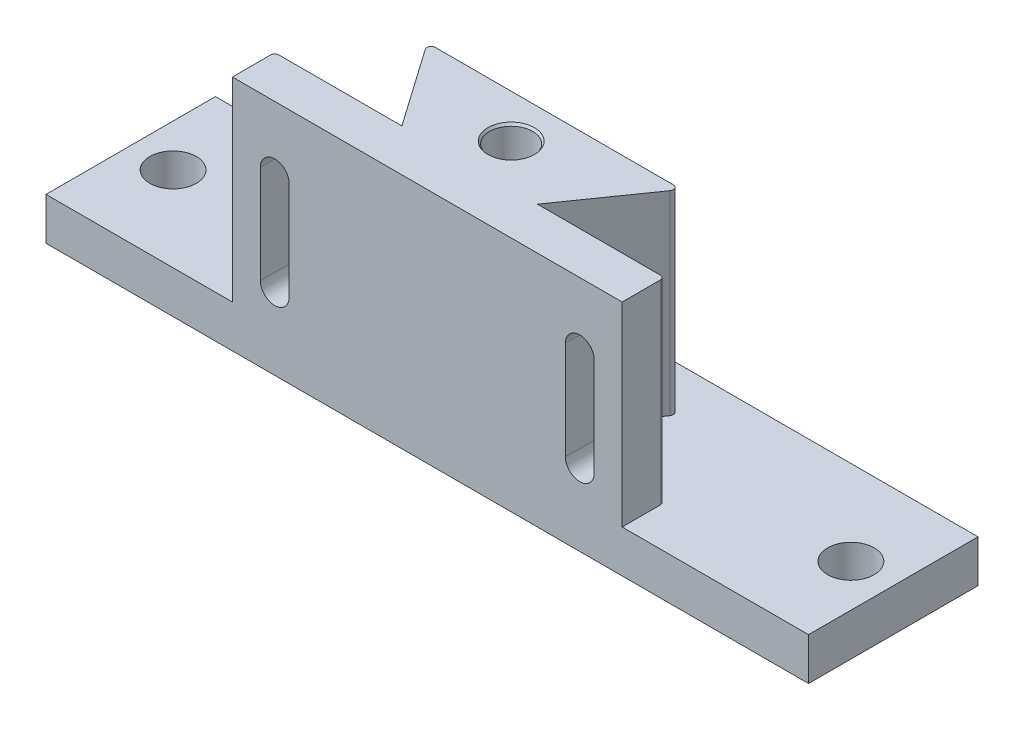
ISO-10303-21;
HEADER;
FILE_DESCRIPTION(('STEP AP214'),'2;1');
FILE_NAME('part.step','',(''),(''),'','','');
FILE_SCHEMA(('AUTOMOTIVE_DESIGN { 1 0 10303 214 1 1 1 1 }'));
ENDSEC;
DATA;
#1=APPLICATION_CONTEXT('core data for automotive mechanical design processes');
#2=APPLICATION_PROTOCOL_DEFINITION('international standard','automotive_design',2000,#1);
#3=PRODUCT_CONTEXT('',#1,'mechanical');
#4=PRODUCT('Part','Part','',(#3));
#5=PRODUCT_RELATED_PRODUCT_CATEGORY('part','',(#4));
#6=PRODUCT_DEFINITION_FORMATION('','',#4);
#7=PRODUCT_DEFINITION_CONTEXT('part definition',#1,'design');
#8=PRODUCT_DEFINITION('design','',#6,#7);
#9=PRODUCT_DEFINITION_SHAPE('','',#8);
#10=(LENGTH_UNIT() NAMED_UNIT(*) SI_UNIT(.MILLI.,.METRE.));
#11=(NAMED_UNIT(*) PLANE_ANGLE_UNIT() SI_UNIT($,.RADIAN.));
#12=(NAMED_UNIT(*) SI_UNIT($,.STERADIAN.) SOLID_ANGLE_UNIT());
#13=UNCERTAINTY_MEASURE_WITH_UNIT(LENGTH_MEASURE(1.E-05),#10,'distance_accuracy_value','');
#14=(GEOMETRIC_REPRESENTATION_CONTEXT(3) GLOBAL_UNCERTAINTY_ASSIGNED_CONTEXT((#13)) GLOBAL_UNIT_ASSIGNED_CONTEXT((#10,
#11,#12)) REPRESENTATION_CONTEXT('',''));
#15=CARTESIAN_POINT('',(0.,0.,0.));
#16=DIRECTION('',(0.,0.,1.));
#17=DIRECTION('',(1.,0.,0.));
#18=AXIS2_PLACEMENT_3D('',#15,#16,#17);
#19=CARTESIAN_POINT('',(0.,5.,0.));
#20=DIRECTION('',(0.,0.,-1.));
#21=DIRECTION('',(-1.,0.,0.));
#22=AXIS2_PLACEMENT_3D('',#19,#20,#21);
#23=PLANE('',#22);
#24=DIRECTION('',(0.,1.,0.));
#25=VECTOR('',#24,1.);
#26=CARTESIAN_POINT('',(15.3020753820972,8.8356786710353,0.));
#27=LINE('',#26,#25);
#28=CARTESIAN_POINT('',(15.3020753820972,8.8356786710353,0.));
#29=VERTEX_POINT('',#28);
#30=CARTESIAN_POINT('',(15.3020753820972,20.4356786710353,0.));
#31=VERTEX_POINT('',#30);
#32=EDGE_CURVE('E361',#29,#31,#27,.T.);
#33=ORIENTED_EDGE('',*,*,#32,.T.);
#34=CARTESIAN_POINT('',(17.0020753820972,20.4356786710353,0.));
#35=DIRECTION('',(0.,0.,1.));
#36=DIRECTION('',(1.,0.,0.));
#37=AXIS2_PLACEMENT_3D('',#34,#35,#36);
#38=CIRCLE('',#37,1.69999999999999);
#39=CARTESIAN_POINT('',(18.7020753820972,20.4356786710353,0.));
#40=VERTEX_POINT('',#39);
#41=EDGE_CURVE('E367',#40,#31,#38,.T.);
#42=ORIENTED_EDGE('',*,*,#41,.F.);
#43=DIRECTION('',(0.,1.,0.));
#44=VECTOR('',#43,1.);
#45=CARTESIAN_POINT('',(18.7020753820972,8.8356786710353,0.));
#46=LINE('',#45,#44);
#47=CARTESIAN_POINT('',(18.7020753820972,8.8356786710353,0.));
#48=VERTEX_POINT('',#47);
#49=EDGE_CURVE('E379',#48,#40,#46,.T.);
#50=ORIENTED_EDGE('',*,*,#49,.F.);
#51=CARTESIAN_POINT('',(17.0020753820972,8.8356786710353,0.));
#52=DIRECTION('',(0.,0.,1.));
#53=DIRECTION('',(1.,0.,0.));
#54=AXIS2_PLACEMENT_3D('',#51,#52,#53);
#55=CIRCLE('',#54,1.69999999999999);
#56=EDGE_CURVE('E377',#29,#48,#55,.T.);
#57=ORIENTED_EDGE('',*,*,#56,.F.);
#58=EDGE_LOOP('',(#33,#42,#50,#57));
#59=FACE_BOUND('',#58,.T.);
#60=DIRECTION('',(1.,0.,0.));
#61=VECTOR('',#60,1.);
#62=CARTESIAN_POINT('',(0.,5.,0.));
#63=LINE('',#62,#61);
#64=CARTESIAN_POINT('',(57.9979246179028,5.,0.));
#65=VERTEX_POINT('',#64);
#66=CARTESIAN_POINT('',(80.,5.,0.));
#67=VERTEX_POINT('',#66);
#68=EDGE_CURVE('E523',#65,#67,#63,.T.);
#69=ORIENTED_EDGE('',*,*,#68,.F.);
#70=DIRECTION('',(0.,-1.,0.));
#71=VECTOR('',#70,1.);
#72=CARTESIAN_POINT('',(57.9979246179028,28.,0.));
#73=LINE('',#72,#71);
#74=CARTESIAN_POINT('',(57.9979246179028,28.,0.));
#75=VERTEX_POINT('',#74);
#76=EDGE_CURVE('E485',#75,#65,#73,.T.);
#77=ORIENTED_EDGE('',*,*,#76,.F.);
#78=DIRECTION('',(1.,0.,0.));
#79=VECTOR('',#78,1.);
#80=CARTESIAN_POINT('',(0.,28.,0.));
#81=LINE('',#80,#79);
#82=CARTESIAN_POINT('',(12.0020753820972,28.,0.));
#83=VERTEX_POINT('',#82);
#84=EDGE_CURVE('E452',#83,#75,#81,.T.);
#85=ORIENTED_EDGE('',*,*,#84,.F.);
#86=DIRECTION('',(0.,-1.,0.));
#87=VECTOR('',#86,1.);
#88=CARTESIAN_POINT('',(12.0020753820972,28.,0.));
#89=LINE('',#88,#87);
#90=CARTESIAN_POINT('',(12.0020753820972,5.,0.));
#91=VERTEX_POINT('',#90);
#92=EDGE_CURVE('E488',#83,#91,#89,.T.);
#93=ORIENTED_EDGE('',*,*,#92,.T.);
#94=CARTESIAN_POINT('',(-10.,5.,0.));
#95=VERTEX_POINT('',#94);
#96=EDGE_CURVE('E518',#95,#91,#63,.T.);
#97=ORIENTED_EDGE('',*,*,#96,.F.);
#98=DIRECTION('',(0.,-1.,0.));
#99=VECTOR('',#98,1.);
#100=CARTESIAN_POINT('',(-10.,5.,0.));
#101=LINE('',#100,#99);
#102=CARTESIAN_POINT('',(-10.,0.,0.));
#103=VERTEX_POINT('',#102);
#104=EDGE_CURVE('E533',#95,#103,#101,.T.);
#105=ORIENTED_EDGE('',*,*,#104,.T.);
#106=DIRECTION('',(1.,0.,0.));
#107=VECTOR('',#106,1.);
#108=CARTESIAN_POINT('',(0.,0.,0.));
#109=LINE('',#108,#107);
#110=CARTESIAN_POINT('',(80.,0.,0.));
#111=VERTEX_POINT('',#110);
#112=EDGE_CURVE('E517',#103,#111,#109,.T.);
#113=ORIENTED_EDGE('',*,*,#112,.T.);
#114=DIRECTION('',(0.,-1.,0.));
#115=VECTOR('',#114,1.);
#116=CARTESIAN_POINT('',(80.,5.,0.));
#117=LINE('',#116,#115);
#118=EDGE_CURVE('E556',#67,#111,#117,.T.);
#119=ORIENTED_EDGE('',*,*,#118,.F.);
#120=EDGE_LOOP('',(#69,#77,#85,#93,#97,#105,#113,#119));
#121=FACE_BOUND('',#120,.T.);
#122=CARTESIAN_POINT('',(52.9979246179028,20.4356786710353,0.));
#123=DIRECTION('',(0.,0.,1.));
#124=DIRECTION('',(1.,0.,0.));
#125=AXIS2_PLACEMENT_3D('',#122,#123,#124);
#126=CIRCLE('',#125,1.69999999999999);
#127=CARTESIAN_POINT('',(54.6979246179029,20.4356786710353,0.));
#128=VERTEX_POINT('',#127);
#129=CARTESIAN_POINT('',(51.2979246179029,20.4356786710353,0.));
#130=VERTEX_POINT('',#129);
#131=EDGE_CURVE('E413',#128,#130,#126,.T.);
#132=ORIENTED_EDGE('',*,*,#131,.F.);
#133=DIRECTION('',(0.,1.,0.));
#134=VECTOR('',#133,1.);
#135=CARTESIAN_POINT('',(54.6979246179029,8.8356786710353,0.));
#136=LINE('',#135,#134);
#137=CARTESIAN_POINT('',(54.6979246179028,8.8356786710353,0.));
#138=VERTEX_POINT('',#137);
#139=EDGE_CURVE('E366',#138,#128,#136,.T.);
#140=ORIENTED_EDGE('',*,*,#139,.F.);
#141=CARTESIAN_POINT('',(52.9979246179028,8.8356786710353,0.));
#142=DIRECTION('',(0.,0.,1.));
#143=DIRECTION('',(1.,0.,0.));
#144=AXIS2_PLACEMENT_3D('',#141,#142,#143);
#145=CIRCLE('',#144,1.69999999999999);
#146=CARTESIAN_POINT('',(51.2979246179029,8.8356786710353,0.));
#147=VERTEX_POINT('',#146);
#148=EDGE_CURVE('E403',#147,#138,#145,.T.);
#149=ORIENTED_EDGE('',*,*,#148,.F.);
#150=DIRECTION('',(0.,1.,0.));
#151=VECTOR('',#150,1.);
#152=CARTESIAN_POINT('',(51.2979246179029,8.8356786710353,0.));
#153=LINE('',#152,#151);
#154=EDGE_CURVE('E395',#147,#130,#153,.T.);
#155=ORIENTED_EDGE('',*,*,#154,.T.);
#156=EDGE_LOOP('',(#132,#140,#149,#155));
#157=FACE_BOUND('',#156,.T.);
#158=ADVANCED_FACE('F192',(#59,#121,#157),#23,.F.);
#159=CARTESIAN_POINT('',(80.,5.,0.));
#160=DIRECTION('',(-1.,0.,0.));
#161=DIRECTION('',(0.,0.,1.));
#162=AXIS2_PLACEMENT_3D('',#159,#160,#161);
#163=PLANE('',#162);
#164=DIRECTION('',(0.,0.,-1.));
#165=VECTOR('',#164,1.);
#166=CARTESIAN_POINT('',(80.,0.,0.));
#167=LINE('',#166,#165);
#168=CARTESIAN_POINT('',(80.,0.,-20.));
#169=VERTEX_POINT('',#168);
#170=EDGE_CURVE('E536',#111,#169,#167,.T.);
#171=ORIENTED_EDGE('',*,*,#170,.T.);
#172=DIRECTION('',(0.,-1.,0.));
#173=VECTOR('',#172,1.);
#174=CARTESIAN_POINT('',(80.,5.,-20.));
#175=LINE('',#174,#173);
#176=CARTESIAN_POINT('',(80.,5.,-20.));
#177=VERTEX_POINT('',#176);
#178=EDGE_CURVE('E553',#177,#169,#175,.T.);
#179=ORIENTED_EDGE('',*,*,#178,.F.);
#180=DIRECTION('',(0.,0.,-1.));
#181=VECTOR('',#180,1.);
#182=CARTESIAN_POINT('',(80.,5.,0.));
#183=LINE('',#182,#181);
#184=EDGE_CURVE('E522',#67,#177,#183,.T.);
#185=ORIENTED_EDGE('',*,*,#184,.F.);
#186=ORIENTED_EDGE('',*,*,#118,.T.);
#187=EDGE_LOOP('',(#171,#179,#185,#186));
#188=FACE_BOUND('',#187,.T.);
#189=ADVANCED_FACE('F649',(#188),#163,.F.);
#190=CARTESIAN_POINT('',(0.,5.,-20.));
#191=DIRECTION('',(0.,0.,-1.));
#192=DIRECTION('',(-1.,0.,0.));
#193=AXIS2_PLACEMENT_3D('',#190,#191,#192);
#194=PLANE('',#193);
#195=DIRECTION('',(1.,0.,0.));
#196=VECTOR('',#195,1.);
#197=CARTESIAN_POINT('',(0.,0.,-20.));
#198=LINE('',#197,#196);
#199=CARTESIAN_POINT('',(-10.,0.,-20.));
#200=VERTEX_POINT('',#199);
#201=EDGE_CURVE('E540',#200,#169,#198,.T.);
#202=ORIENTED_EDGE('',*,*,#201,.F.);
#203=DIRECTION('',(0.,-1.,0.));
#204=VECTOR('',#203,1.);
#205=CARTESIAN_POINT('',(-10.,5.,-20.));
#206=LINE('',#205,#204);
#207=CARTESIAN_POINT('',(-10.,5.,-20.));
#208=VERTEX_POINT('',#207);
#209=EDGE_CURVE('E550',#208,#200,#206,.T.);
#210=ORIENTED_EDGE('',*,*,#209,.F.);
#211=DIRECTION('',(1.,0.,0.));
#212=VECTOR('',#211,1.);
#213=CARTESIAN_POINT('',(0.,5.,-20.));
#214=LINE('',#213,#212);
#215=EDGE_CURVE('E526',#208,#177,#214,.T.);
#216=ORIENTED_EDGE('',*,*,#215,.T.);
#217=ORIENTED_EDGE('',*,*,#178,.T.);
#218=EDGE_LOOP('',(#202,#210,#216,#217));
#219=FACE_BOUND('',#218,.T.);
#220=ADVANCED_FACE('F654',(#219),#194,.T.);
#221=CARTESIAN_POINT('',(-10.,5.,0.));
#222=DIRECTION('',(1.,0.,0.));
#223=DIRECTION('',(0.,0.,-1.));
#224=AXIS2_PLACEMENT_3D('',#221,#222,#223);
#225=PLANE('',#224);
#226=DIRECTION('',(0.,0.,1.));
#227=VECTOR('',#226,1.);
#228=CARTESIAN_POINT('',(-10.,0.,0.));
#229=LINE('',#228,#227);
#230=EDGE_CURVE('E544',#200,#103,#229,.T.);
#231=ORIENTED_EDGE('',*,*,#230,.T.);
#232=ORIENTED_EDGE('',*,*,#104,.F.);
#233=DIRECTION('',(0.,0.,1.));
#234=VECTOR('',#233,1.);
#235=CARTESIAN_POINT('',(-10.,5.,0.));
#236=LINE('',#235,#234);
#237=EDGE_CURVE('E530',#208,#95,#236,.T.);
#238=ORIENTED_EDGE('',*,*,#237,.F.);
#239=ORIENTED_EDGE('',*,*,#209,.T.);
#240=EDGE_LOOP('',(#231,#232,#238,#239));
#241=FACE_BOUND('',#240,.T.);
#242=ADVANCED_FACE('F748',(#241),#225,.F.);
#243=CARTESIAN_POINT('',(0.,5.,0.));
#244=DIRECTION('',(0.,1.,0.));
#245=DIRECTION('',(0.,0.,1.));
#246=AXIS2_PLACEMENT_3D('',#243,#244,#245);
#247=PLANE('',#246);
#248=CARTESIAN_POINT('',(75.,5.,-10.));
#249=DIRECTION('',(0.,1.,0.));
#250=DIRECTION('',(0.,0.,1.));
#251=AXIS2_PLACEMENT_3D('',#248,#249,#250);
#252=CIRCLE('',#251,2.75);
#253=CARTESIAN_POINT('',(75.,5.,-7.25));
#254=VERTEX_POINT('',#253);
#255=EDGE_CURVE('E432',#254,#254,#252,.T.);
#256=ORIENTED_EDGE('',*,*,#255,.F.);
#257=EDGE_LOOP('',(#256));
#258=FACE_BOUND('',#257,.T.);
#259=CARTESIAN_POINT('',(-5.,5.,-10.));
#260=DIRECTION('',(0.,1.,0.));
#261=DIRECTION('',(0.,0.,1.));
#262=AXIS2_PLACEMENT_3D('',#259,#260,#261);
#263=CIRCLE('',#262,2.75);
#264=CARTESIAN_POINT('',(-5.,5.,-7.25));
#265=VERTEX_POINT('',#264);
#266=EDGE_CURVE('E440',#265,#265,#263,.T.);
#267=ORIENTED_EDGE('',*,*,#266,.F.);
#268=EDGE_LOOP('',(#267));
#269=FACE_BOUND('',#268,.T.);
#270=DIRECTION('',(0.,0.,1.));
#271=VECTOR('',#270,1.);
#272=CARTESIAN_POINT('',(12.0020753820972,5.,0.));
#273=LINE('',#272,#271);
#274=CARTESIAN_POINT('',(12.0020753820972,5.,-4.49999999999988));
#275=VERTEX_POINT('',#274);
#276=EDGE_CURVE('E514',#275,#91,#273,.T.);
#277=ORIENTED_EDGE('',*,*,#276,.F.);
#278=CARTESIAN_POINT('',(12.5020753820972,5.,-4.49999999999988));
#279=DIRECTION('',(0.,1.,0.));
#280=DIRECTION('',(0.,0.,1.));
#281=AXIS2_PLACEMENT_3D('',#278,#279,#280);
#282=CIRCLE('',#281,0.5);
#283=CARTESIAN_POINT('',(12.5020753820972,5.,-4.99999999999988));
#284=VERTEX_POINT('',#283);
#285=EDGE_CURVE('E603',#275,#284,#282,.F.);
#286=ORIENTED_EDGE('',*,*,#285,.T.);
#287=DIRECTION('',(1.,0.,0.));
#288=VECTOR('',#287,1.);
#289=CARTESIAN_POINT('',(0.,5.,-4.99999999999978));
#290=LINE('',#289,#288);
#291=CARTESIAN_POINT('',(27.0020753820972,5.,-5.));
#292=VERTEX_POINT('',#291);
#293=EDGE_CURVE('E492',#284,#292,#290,.T.);
#294=ORIENTED_EDGE('',*,*,#293,.T.);
#295=DIRECTION('',(-0.57357643635105,0.,-0.819152044288989));
#296=VECTOR('',#295,1.);
#297=CARTESIAN_POINT('',(20.4678960891509,5.,-14.3317751329167));
#298=LINE('',#297,#296);
#299=CARTESIAN_POINT('',(20.5509150413411,5.,-14.2132117818245));
#300=VERTEX_POINT('',#299);
#301=EDGE_CURVE('E495',#292,#300,#298,.T.);
#302=ORIENTED_EDGE('',*,*,#301,.T.);
#303=CARTESIAN_POINT('',(20.9604910634856,5.,-14.5));
#304=DIRECTION('',(0.,1.,0.));
#305=DIRECTION('',(0.,0.,1.));
#306=AXIS2_PLACEMENT_3D('',#303,#304,#305);
#307=CIRCLE('',#306,0.5);
#308=CARTESIAN_POINT('',(20.9604910634856,5.,-15.));
#309=VERTEX_POINT('',#308);
#310=EDGE_CURVE('E606',#300,#309,#307,.F.);
#311=ORIENTED_EDGE('',*,*,#310,.T.);
#312=DIRECTION('',(-1.,0.,0.));
#313=VECTOR('',#312,1.);
#314=CARTESIAN_POINT('',(0.,5.,-15.));
#315=LINE('',#314,#313);
#316=CARTESIAN_POINT('',(49.0395089365144,5.,-15.));
#317=VERTEX_POINT('',#316);
#318=EDGE_CURVE('E499',#317,#309,#315,.T.);
#319=ORIENTED_EDGE('',*,*,#318,.F.);
#320=CARTESIAN_POINT('',(49.0395089365144,5.,-14.5));
#321=DIRECTION('',(0.,1.,0.));
#322=DIRECTION('',(0.,0.,1.));
#323=AXIS2_PLACEMENT_3D('',#320,#321,#322);
#324=CIRCLE('',#323,0.5);
#325=CARTESIAN_POINT('',(49.4490849586589,5.,-14.2132117818245));
#326=VERTEX_POINT('',#325);
#327=EDGE_CURVE('E609',#317,#326,#324,.F.);
#328=ORIENTED_EDGE('',*,*,#327,.T.);
#329=DIRECTION('',(0.57357643635105,0.,-0.819152044288989));
#330=VECTOR('',#329,1.);
#331=CARTESIAN_POINT('',(26.5028089272472,5.,18.5574665945902));
#332=LINE('',#331,#330);
#333=CARTESIAN_POINT('',(42.9979246179028,5.,-5.));
#334=VERTEX_POINT('',#333);
#335=EDGE_CURVE('E503',#334,#326,#332,.T.);
#336=ORIENTED_EDGE('',*,*,#335,.F.);
#337=DIRECTION('',(-1.,0.,0.));
#338=VECTOR('',#337,1.);
#339=CARTESIAN_POINT('',(0.,5.,-5.));
#340=LINE('',#339,#338);
#341=CARTESIAN_POINT('',(57.4979246179028,5.,-5.));
#342=VERTEX_POINT('',#341);
#343=EDGE_CURVE('E507',#342,#334,#340,.T.);
#344=ORIENTED_EDGE('',*,*,#343,.F.);
#345=CARTESIAN_POINT('',(57.4979246179028,5.,-4.5));
#346=DIRECTION('',(0.,1.,0.));
#347=DIRECTION('',(0.,0.,1.));
#348=AXIS2_PLACEMENT_3D('',#345,#346,#347);
#349=CIRCLE('',#348,0.5);
#350=CARTESIAN_POINT('',(57.9979246179028,5.,-4.5));
#351=VERTEX_POINT('',#350);
#352=EDGE_CURVE('E600',#342,#351,#349,.F.);
#353=ORIENTED_EDGE('',*,*,#352,.T.);
#354=DIRECTION('',(0.,0.,-1.));
#355=VECTOR('',#354,1.);
#356=CARTESIAN_POINT('',(57.9979246179028,5.,0.));
#357=LINE('',#356,#355);
#358=EDGE_CURVE('E510',#65,#351,#357,.T.);
#359=ORIENTED_EDGE('',*,*,#358,.F.);
#360=ORIENTED_EDGE('',*,*,#68,.T.);
#361=ORIENTED_EDGE('',*,*,#184,.T.);
#362=ORIENTED_EDGE('',*,*,#215,.F.);
#363=ORIENTED_EDGE('',*,*,#237,.T.);
#364=ORIENTED_EDGE('',*,*,#96,.T.);
#365=EDGE_LOOP('',(#277,#286,#294,#302,#311,#319,#328,#336,#344,#353,#359,#360,#361,#362,#363,#364));
#366=FACE_BOUND('',#365,.T.);
#367=ADVANCED_FACE('F697',(#258,#269,#366),#247,.T.);
#368=CARTESIAN_POINT('',(0.,0.,0.));
#369=DIRECTION('',(0.,1.,0.));
#370=DIRECTION('',(0.,0.,1.));
#371=AXIS2_PLACEMENT_3D('',#368,#369,#370);
#372=PLANE('',#371);
#373=CARTESIAN_POINT('',(75.,0.,-10.));
#374=DIRECTION('',(0.,1.,0.));
#375=DIRECTION('',(0.,0.,1.));
#376=AXIS2_PLACEMENT_3D('',#373,#374,#375);
#377=CIRCLE('',#376,2.75);
#378=CARTESIAN_POINT('',(75.,0.,-7.25));
#379=VERTEX_POINT('',#378);
#380=EDGE_CURVE('E436',#379,#379,#377,.T.);
#381=ORIENTED_EDGE('',*,*,#380,.T.);
#382=EDGE_LOOP('',(#381));
#383=FACE_BOUND('',#382,.T.);
#384=CARTESIAN_POINT('',(-5.,0.,-10.));
#385=DIRECTION('',(0.,1.,0.));
#386=DIRECTION('',(0.,0.,1.));
#387=AXIS2_PLACEMENT_3D('',#384,#385,#386);
#388=CIRCLE('',#387,2.75);
#389=CARTESIAN_POINT('',(-5.,0.,-7.25000000000001));
#390=VERTEX_POINT('',#389);
#391=EDGE_CURVE('E444',#390,#390,#388,.T.);
#392=ORIENTED_EDGE('',*,*,#391,.T.);
#393=EDGE_LOOP('',(#392));
#394=FACE_BOUND('',#393,.T.);
#395=ORIENTED_EDGE('',*,*,#170,.F.);
#396=ORIENTED_EDGE('',*,*,#112,.F.);
#397=ORIENTED_EDGE('',*,*,#230,.F.);
#398=ORIENTED_EDGE('',*,*,#201,.T.);
#399=EDGE_LOOP('',(#395,#396,#397,#398));
#400=FACE_BOUND('',#399,.T.);
#401=ADVANCED_FACE('F745',(#383,#394,#400),#372,.F.);
#402=CARTESIAN_POINT('',(12.0020753820972,28.,0.));
#403=DIRECTION('',(-1.,0.,0.));
#404=DIRECTION('',(0.,0.,1.));
#405=AXIS2_PLACEMENT_3D('',#402,#403,#404);
#406=PLANE('',#405);
#407=DIRECTION('',(0.,0.,-1.));
#408=VECTOR('',#407,1.);
#409=CARTESIAN_POINT('',(12.0020753820972,28.,0.));
#410=LINE('',#409,#408);
#411=CARTESIAN_POINT('',(12.0020753820972,28.,-4.49999999999988));
#412=VERTEX_POINT('',#411);
#413=EDGE_CURVE('E448',#83,#412,#410,.T.);
#414=ORIENTED_EDGE('',*,*,#413,.T.);
#415=DIRECTION('',(0.,-1.,0.));
#416=VECTOR('',#415,1.);
#417=CARTESIAN_POINT('',(12.0020753820972,5.,-4.49999999999988));
#418=LINE('',#417,#416);
#419=EDGE_CURVE('E579',#412,#275,#418,.T.);
#420=ORIENTED_EDGE('',*,*,#419,.T.);
#421=ORIENTED_EDGE('',*,*,#276,.T.);
#422=ORIENTED_EDGE('',*,*,#92,.F.);
#423=EDGE_LOOP('',(#414,#420,#421,#422));
#424=FACE_BOUND('',#423,.T.);
#425=ADVANCED_FACE('F695',(#424),#406,.T.);
#426=CARTESIAN_POINT('',(57.9979246179028,28.,0.));
#427=DIRECTION('',(1.,0.,0.));
#428=DIRECTION('',(0.,0.,-1.));
#429=AXIS2_PLACEMENT_3D('',#426,#427,#428);
#430=PLANE('',#429);
#431=ORIENTED_EDGE('',*,*,#358,.T.);
#432=DIRECTION('',(0.,-1.,0.));
#433=VECTOR('',#432,1.);
#434=CARTESIAN_POINT('',(57.9979246179028,28.,-4.5));
#435=LINE('',#434,#433);
#436=CARTESIAN_POINT('',(57.9979246179028,28.,-4.5));
#437=VERTEX_POINT('',#436);
#438=EDGE_CURVE('E564',#351,#437,#435,.F.);
#439=ORIENTED_EDGE('',*,*,#438,.T.);
#440=DIRECTION('',(0.,0.,1.));
#441=VECTOR('',#440,1.);
#442=CARTESIAN_POINT('',(57.9979246179028,28.,0.));
#443=LINE('',#442,#441);
#444=EDGE_CURVE('E456',#437,#75,#443,.T.);
#445=ORIENTED_EDGE('',*,*,#444,.T.);
#446=ORIENTED_EDGE('',*,*,#76,.T.);
#447=EDGE_LOOP('',(#431,#439,#445,#446));
#448=FACE_BOUND('',#447,.T.);
#449=ADVANCED_FACE('F739',(#448),#430,.T.);
#450=CARTESIAN_POINT('',(0.,28.,-5.));
#451=DIRECTION('',(0.,0.,-1.));
#452=DIRECTION('',(-1.,0.,0.));
#453=AXIS2_PLACEMENT_3D('',#450,#451,#452);
#454=PLANE('',#453);
#455=DIRECTION('',(0.,1.,0.));
#456=VECTOR('',#455,1.);
#457=CARTESIAN_POINT('',(51.2979246179028,28.,-5.));
#458=LINE('',#457,#456);
#459=CARTESIAN_POINT('',(51.2979246179028,8.8356786710353,-5.));
#460=VERTEX_POINT('',#459);
#461=CARTESIAN_POINT('',(51.2979246179028,20.4356786710353,-5.));
#462=VERTEX_POINT('',#461);
#463=EDGE_CURVE('E622',#460,#462,#458,.T.);
#464=ORIENTED_EDGE('',*,*,#463,.F.);
#465=CARTESIAN_POINT('',(52.9979246179028,8.8356786710353,-5.));
#466=DIRECTION('',(0.,0.,-1.));
#467=DIRECTION('',(-1.,0.,0.));
#468=AXIS2_PLACEMENT_3D('',#465,#466,#467);
#469=CIRCLE('',#468,1.69999999999999);
#470=CARTESIAN_POINT('',(54.6979246179028,8.8356786710353,-5.));
#471=VERTEX_POINT('',#470);
#472=EDGE_CURVE('E615',#471,#460,#469,.T.);
#473=ORIENTED_EDGE('',*,*,#472,.F.);
#474=DIRECTION('',(0.,-1.,0.));
#475=VECTOR('',#474,1.);
#476=CARTESIAN_POINT('',(54.6979246179028,28.,-5.));
#477=LINE('',#476,#475);
#478=CARTESIAN_POINT('',(54.6979246179028,20.4356786710353,-5.));
#479=VERTEX_POINT('',#478);
#480=EDGE_CURVE('E612',#479,#471,#477,.T.);
#481=ORIENTED_EDGE('',*,*,#480,.F.);
#482=CARTESIAN_POINT('',(52.9979246179028,20.4356786710353,-5.));
#483=DIRECTION('',(0.,0.,-1.));
#484=DIRECTION('',(-1.,0.,0.));
#485=AXIS2_PLACEMENT_3D('',#482,#483,#484);
#486=CIRCLE('',#485,1.69999999999999);
#487=EDGE_CURVE('E618',#462,#479,#486,.T.);
#488=ORIENTED_EDGE('',*,*,#487,.F.);
#489=EDGE_LOOP('',(#464,#473,#481,#488));
#490=FACE_BOUND('',#489,.T.);
#491=DIRECTION('',(1.,0.,0.));
#492=VECTOR('',#491,1.);
#493=CARTESIAN_POINT('',(0.,28.,-5.));
#494=LINE('',#493,#492);
#495=CARTESIAN_POINT('',(42.9979246179028,28.,-5.));
#496=VERTEX_POINT('',#495);
#497=CARTESIAN_POINT('',(57.4979246179028,28.,-5.));
#498=VERTEX_POINT('',#497);
#499=EDGE_CURVE('E459',#496,#498,#494,.T.);
#500=ORIENTED_EDGE('',*,*,#499,.T.);
#501=DIRECTION('',(0.,-1.,0.));
#502=VECTOR('',#501,1.);
#503=CARTESIAN_POINT('',(57.4979246179028,28.,-5.));
#504=LINE('',#503,#502);
#505=EDGE_CURVE('E560',#498,#342,#504,.T.);
#506=ORIENTED_EDGE('',*,*,#505,.T.);
#507=ORIENTED_EDGE('',*,*,#343,.T.);
#508=DIRECTION('',(0.,-1.,0.));
#509=VECTOR('',#508,1.);
#510=CARTESIAN_POINT('',(42.9979246179028,28.,-5.));
#511=LINE('',#510,#509);
#512=EDGE_CURVE('E481',#496,#334,#511,.T.);
#513=ORIENTED_EDGE('',*,*,#512,.F.);
#514=EDGE_LOOP('',(#500,#506,#507,#513));
#515=FACE_BOUND('',#514,.T.);
#516=ADVANCED_FACE('F714',(#490,#515),#454,.T.);
#517=CARTESIAN_POINT('',(26.5028089272472,28.,18.5574665945902));
#518=DIRECTION('',(0.819152044288989,0.,0.57357643635105));
#519=DIRECTION('',(0.57357643635105,0.,-0.819152044288989));
#520=AXIS2_PLACEMENT_3D('',#517,#518,#519);
#521=PLANE('',#520);
#522=ORIENTED_EDGE('',*,*,#335,.T.);
#523=DIRECTION('',(0.,-1.,0.));
#524=VECTOR('',#523,1.);
#525=CARTESIAN_POINT('',(49.4490849586589,28.,-14.2132117818245));
#526=LINE('',#525,#524);
#527=CARTESIAN_POINT('',(49.4490849586589,28.,-14.2132117818245));
#528=VERTEX_POINT('',#527);
#529=EDGE_CURVE('E597',#326,#528,#526,.F.);
#530=ORIENTED_EDGE('',*,*,#529,.T.);
#531=DIRECTION('',(-0.57357643635105,0.,0.819152044288989));
#532=VECTOR('',#531,1.);
#533=CARTESIAN_POINT('',(26.5028089272472,28.,18.5574665945902));
#534=LINE('',#533,#532);
#535=EDGE_CURVE('E463',#528,#496,#534,.T.);
#536=ORIENTED_EDGE('',*,*,#535,.T.);
#537=ORIENTED_EDGE('',*,*,#512,.T.);
#538=EDGE_LOOP('',(#522,#530,#536,#537));
#539=FACE_BOUND('',#538,.T.);
#540=ADVANCED_FACE('F721',(#539),#521,.T.);
#541=CARTESIAN_POINT('',(0.,28.,-15.));
#542=DIRECTION('',(0.,0.,-1.));
#543=DIRECTION('',(-1.,0.,0.));
#544=AXIS2_PLACEMENT_3D('',#541,#542,#543);
#545=PLANE('',#544);
#546=ORIENTED_EDGE('',*,*,#318,.T.);
#547=DIRECTION('',(0.,-1.,0.));
#548=VECTOR('',#547,1.);
#549=CARTESIAN_POINT('',(20.9604910634856,28.,-15.));
#550=LINE('',#549,#548);
#551=CARTESIAN_POINT('',(20.9604910634856,28.,-15.));
#552=VERTEX_POINT('',#551);
#553=EDGE_CURVE('E594',#309,#552,#550,.F.);
#554=ORIENTED_EDGE('',*,*,#553,.T.);
#555=DIRECTION('',(1.,0.,0.));
#556=VECTOR('',#555,1.);
#557=CARTESIAN_POINT('',(0.,28.,-15.));
#558=LINE('',#557,#556);
#559=CARTESIAN_POINT('',(49.0395089365144,28.,-15.));
#560=VERTEX_POINT('',#559);
#561=EDGE_CURVE('E466',#552,#560,#558,.T.);
#562=ORIENTED_EDGE('',*,*,#561,.T.);
#563=DIRECTION('',(0.,-1.,0.));
#564=VECTOR('',#563,1.);
#565=CARTESIAN_POINT('',(49.0395089365144,28.,-15.));
#566=LINE('',#565,#564);
#567=EDGE_CURVE('E590',#560,#317,#566,.T.);
#568=ORIENTED_EDGE('',*,*,#567,.T.);
#569=EDGE_LOOP('',(#546,#554,#562,#568));
#570=FACE_BOUND('',#569,.T.);
#571=ADVANCED_FACE('F726',(#570),#545,.T.);
#572=CARTESIAN_POINT('',(20.4678960891509,28.,-14.3317751329167));
#573=DIRECTION('',(0.819152044288989,0.,-0.57357643635105));
#574=DIRECTION('',(-0.57357643635105,0.,-0.819152044288989));
#575=AXIS2_PLACEMENT_3D('',#572,#573,#574);
#576=PLANE('',#575);
#577=DIRECTION('',(0.57357643635105,0.,0.819152044288989));
#578=VECTOR('',#577,1.);
#579=CARTESIAN_POINT('',(20.4678960891509,28.,-14.3317751329167));
#580=LINE('',#579,#578);
#581=CARTESIAN_POINT('',(20.5509150413411,28.,-14.2132117818245));
#582=VERTEX_POINT('',#581);
#583=CARTESIAN_POINT('',(27.0020753820972,28.,-5.));
#584=VERTEX_POINT('',#583);
#585=EDGE_CURVE('E470',#582,#584,#580,.T.);
#586=ORIENTED_EDGE('',*,*,#585,.F.);
#587=DIRECTION('',(0.,-1.,0.));
#588=VECTOR('',#587,1.);
#589=CARTESIAN_POINT('',(20.5509150413411,5.,-14.2132117818245));
#590=LINE('',#589,#588);
#591=EDGE_CURVE('E586',#582,#300,#590,.T.);
#592=ORIENTED_EDGE('',*,*,#591,.T.);
#593=ORIENTED_EDGE('',*,*,#301,.F.);
#594=DIRECTION('',(0.,-1.,0.));
#595=VECTOR('',#594,1.);
#596=CARTESIAN_POINT('',(27.0020753820972,28.,-5.));
#597=LINE('',#596,#595);
#598=EDGE_CURVE('E477',#584,#292,#597,.T.);
#599=ORIENTED_EDGE('',*,*,#598,.F.);
#600=EDGE_LOOP('',(#586,#592,#593,#599));
#601=FACE_BOUND('',#600,.T.);
#602=ADVANCED_FACE('F685',(#601),#576,.F.);
#603=CARTESIAN_POINT('',(0.,28.,-4.99999999999978));
#604=DIRECTION('',(0.,0.,1.));
#605=DIRECTION('',(1.,0.,0.));
#606=AXIS2_PLACEMENT_3D('',#603,#604,#605);
#607=PLANE('',#606);
#608=CARTESIAN_POINT('',(17.0020753820972,20.4356786710353,-4.99999999999992));
#609=DIRECTION('',(0.,0.,1.));
#610=DIRECTION('',(1.,0.,0.));
#611=AXIS2_PLACEMENT_3D('',#608,#609,#610);
#612=CIRCLE('',#611,1.69999999999999);
#613=CARTESIAN_POINT('',(18.7020753820972,20.4356786710353,-4.99999999999993));
#614=VERTEX_POINT('',#613);
#615=CARTESIAN_POINT('',(15.3020753820972,20.4356786710353,-4.9999999999999));
#616=VERTEX_POINT('',#615);
#617=EDGE_CURVE('E201',#614,#616,#612,.T.);
#618=ORIENTED_EDGE('',*,*,#617,.T.);
#619=DIRECTION('',(0.,-1.,0.));
#620=VECTOR('',#619,1.);
#621=CARTESIAN_POINT('',(15.3020753820972,28.,-4.9999999999999));
#622=LINE('',#621,#620);
#623=CARTESIAN_POINT('',(15.3020753820972,8.8356786710353,-4.9999999999999));
#624=VERTEX_POINT('',#623);
#625=EDGE_CURVE('E13',#616,#624,#622,.T.);
#626=ORIENTED_EDGE('',*,*,#625,.T.);
#627=CARTESIAN_POINT('',(17.0020753820972,8.8356786710353,-4.99999999999992));
#628=DIRECTION('',(0.,0.,1.));
#629=DIRECTION('',(1.,0.,0.));
#630=AXIS2_PLACEMENT_3D('',#627,#628,#629);
#631=CIRCLE('',#630,1.69999999999999);
#632=CARTESIAN_POINT('',(18.7020753820972,8.8356786710353,-4.99999999999993));
#633=VERTEX_POINT('',#632);
#634=EDGE_CURVE('E629',#624,#633,#631,.T.);
#635=ORIENTED_EDGE('',*,*,#634,.T.);
#636=DIRECTION('',(0.,1.,0.));
#637=VECTOR('',#636,1.);
#638=CARTESIAN_POINT('',(18.7020753820972,28.,-4.99999999999993));
#639=LINE('',#638,#637);
#640=EDGE_CURVE('E625',#633,#614,#639,.T.);
#641=ORIENTED_EDGE('',*,*,#640,.T.);
#642=EDGE_LOOP('',(#618,#626,#635,#641));
#643=FACE_BOUND('',#642,.T.);
#644=ORIENTED_EDGE('',*,*,#293,.F.);
#645=DIRECTION('',(0.,-1.,0.));
#646=VECTOR('',#645,1.);
#647=CARTESIAN_POINT('',(12.5020753820972,28.,-4.99999999999988));
#648=LINE('',#647,#646);
#649=CARTESIAN_POINT('',(12.5020753820972,28.,-4.99999999999988));
#650=VERTEX_POINT('',#649);
#651=EDGE_CURVE('E583',#284,#650,#648,.F.);
#652=ORIENTED_EDGE('',*,*,#651,.T.);
#653=DIRECTION('',(-1.,0.,0.));
#654=VECTOR('',#653,1.);
#655=CARTESIAN_POINT('',(0.,28.,-4.99999999999978));
#656=LINE('',#655,#654);
#657=EDGE_CURVE('E473',#584,#650,#656,.T.);
#658=ORIENTED_EDGE('',*,*,#657,.F.);
#659=ORIENTED_EDGE('',*,*,#598,.T.);
#660=EDGE_LOOP('',(#644,#652,#658,#659));
#661=FACE_BOUND('',#660,.T.);
#662=ADVANCED_FACE('F634',(#643,#661),#607,.F.);
#663=CARTESIAN_POINT('',(0.,28.,0.));
#664=DIRECTION('',(0.,1.,0.));
#665=DIRECTION('',(0.,0.,1.));
#666=AXIS2_PLACEMENT_3D('',#663,#664,#665);
#667=PLANE('',#666);
#668=CARTESIAN_POINT('',(35.,28.,-9.9));
#669=DIRECTION('',(0.,1.,0.));
#670=DIRECTION('',(0.,0.,1.));
#671=AXIS2_PLACEMENT_3D('',#668,#669,#670);
#672=CIRCLE('',#671,2.75);
#673=CARTESIAN_POINT('',(35.,28.,-7.15));
#674=VERTEX_POINT('',#673);
#675=EDGE_CURVE('E420',#674,#674,#672,.T.);
#676=ORIENTED_EDGE('',*,*,#675,.F.);
#677=EDGE_LOOP('',(#676));
#678=FACE_BOUND('',#677,.T.);
#679=ORIENTED_EDGE('',*,*,#444,.F.);
#680=CARTESIAN_POINT('',(57.4979246179028,28.,-4.5));
#681=DIRECTION('',(0.,1.,0.));
#682=DIRECTION('',(0.,0.,1.));
#683=AXIS2_PLACEMENT_3D('',#680,#681,#682);
#684=CIRCLE('',#683,0.5);
#685=EDGE_CURVE('E576',#437,#498,#684,.T.);
#686=ORIENTED_EDGE('',*,*,#685,.T.);
#687=ORIENTED_EDGE('',*,*,#499,.F.);
#688=ORIENTED_EDGE('',*,*,#535,.F.);
#689=CARTESIAN_POINT('',(49.0395089365144,28.,-14.5));
#690=DIRECTION('',(0.,1.,0.));
#691=DIRECTION('',(0.,0.,1.));
#692=AXIS2_PLACEMENT_3D('',#689,#690,#691);
#693=CIRCLE('',#692,0.5);
#694=EDGE_CURVE('E567',#528,#560,#693,.T.);
#695=ORIENTED_EDGE('',*,*,#694,.T.);
#696=ORIENTED_EDGE('',*,*,#561,.F.);
#697=CARTESIAN_POINT('',(20.9604910634856,28.,-14.5));
#698=DIRECTION('',(0.,1.,0.));
#699=DIRECTION('',(0.,0.,1.));
#700=AXIS2_PLACEMENT_3D('',#697,#698,#699);
#701=CIRCLE('',#700,0.5);
#702=EDGE_CURVE('E570',#552,#582,#701,.T.);
#703=ORIENTED_EDGE('',*,*,#702,.T.);
#704=ORIENTED_EDGE('',*,*,#585,.T.);
#705=ORIENTED_EDGE('',*,*,#657,.T.);
#706=CARTESIAN_POINT('',(12.5020753820972,28.,-4.49999999999988));
#707=DIRECTION('',(0.,1.,0.));
#708=DIRECTION('',(0.,0.,1.));
#709=AXIS2_PLACEMENT_3D('',#706,#707,#708);
#710=CIRCLE('',#709,0.5);
#711=EDGE_CURVE('E573',#650,#412,#710,.T.);
#712=ORIENTED_EDGE('',*,*,#711,.T.);
#713=ORIENTED_EDGE('',*,*,#413,.F.);
#714=ORIENTED_EDGE('',*,*,#84,.T.);
#715=EDGE_LOOP('',(#679,#686,#687,#688,#695,#696,#703,#704,#705,#712,#713,#714));
#716=FACE_BOUND('',#715,.T.);
#717=ADVANCED_FACE('F682',(#678,#716),#667,.T.);
#718=CARTESIAN_POINT('',(-5.,5.,-10.));
#719=DIRECTION('',(0.,1.,0.));
#720=DIRECTION('',(0.,0.,1.));
#721=AXIS2_PLACEMENT_3D('',#718,#719,#720);
#722=CYLINDRICAL_SURFACE('',#721,2.75);
#723=ORIENTED_EDGE('',*,*,#266,.T.);
#724=EDGE_LOOP('',(#723));
#725=FACE_BOUND('',#724,.T.);
#726=ORIENTED_EDGE('',*,*,#391,.F.);
#727=EDGE_LOOP('',(#726));
#728=FACE_BOUND('',#727,.T.);
#729=ADVANCED_FACE('F821',(#725,#728),#722,.F.);
#730=CARTESIAN_POINT('',(75.,5.,-10.));
#731=DIRECTION('',(0.,1.,0.));
#732=DIRECTION('',(0.,0.,1.));
#733=AXIS2_PLACEMENT_3D('',#730,#731,#732);
#734=CYLINDRICAL_SURFACE('',#733,2.75);
#735=ORIENTED_EDGE('',*,*,#255,.T.);
#736=EDGE_LOOP('',(#735));
#737=FACE_BOUND('',#736,.T.);
#738=ORIENTED_EDGE('',*,*,#380,.F.);
#739=EDGE_LOOP('',(#738));
#740=FACE_BOUND('',#739,.T.);
#741=ADVANCED_FACE('F933',(#737,#740),#734,.F.);
#742=CARTESIAN_POINT('',(35.,13.,-9.9));
#743=DIRECTION('',(0.,1.,0.));
#744=DIRECTION('',(0.,0.,1.));
#745=AXIS2_PLACEMENT_3D('',#742,#743,#744);
#746=CONICAL_SURFACE('',#745,2.55,1.02974425867665);
#747=CARTESIAN_POINT('',(35.,11.4678054214797,-9.9));
#748=VERTEX_POINT('',#747);
#749=VERTEX_LOOP('',#748);
#750=FACE_BOUND('',#749,.T.);
#751=CARTESIAN_POINT('',(35.,13.,-9.9));
#752=DIRECTION('',(0.,1.,0.));
#753=DIRECTION('',(0.,0.,1.));
#754=AXIS2_PLACEMENT_3D('',#751,#752,#753);
#755=CIRCLE('',#754,2.55);
#756=CARTESIAN_POINT('',(35.,13.,-7.35));
#757=VERTEX_POINT('',#756);
#758=EDGE_CURVE('E428',#757,#757,#755,.T.);
#759=ORIENTED_EDGE('',*,*,#758,.T.);
#760=EDGE_LOOP('',(#759));
#761=FACE_BOUND('',#760,.T.);
#762=ADVANCED_FACE('F929',(#750,#761),#746,.F.);
#763=CARTESIAN_POINT('',(35.,28.,-9.9));
#764=DIRECTION('',(0.,1.,0.));
#765=DIRECTION('',(0.,0.,1.));
#766=AXIS2_PLACEMENT_3D('',#763,#764,#765);
#767=CYLINDRICAL_SURFACE('',#766,2.55);
#768=ORIENTED_EDGE('',*,*,#758,.F.);
#769=EDGE_LOOP('',(#768));
#770=FACE_BOUND('',#769,.T.);
#771=CARTESIAN_POINT('',(35.,27.7143703986516,-9.9));
#772=DIRECTION('',(0.,1.,0.));
#773=DIRECTION('',(0.,0.,1.));
#774=AXIS2_PLACEMENT_3D('',#771,#772,#773);
#775=CIRCLE('',#774,2.55);
#776=CARTESIAN_POINT('',(35.,27.7143703986516,-7.35));
#777=VERTEX_POINT('',#776);
#778=EDGE_CURVE('E424',#777,#777,#775,.T.);
#779=ORIENTED_EDGE('',*,*,#778,.T.);
#780=EDGE_LOOP('',(#779));
#781=FACE_BOUND('',#780,.T.);
#782=ADVANCED_FACE('F925',(#770,#781),#767,.F.);
#783=CARTESIAN_POINT('',(35.,28.,-9.9));
#784=DIRECTION('',(0.,1.,0.));
#785=DIRECTION('',(0.,0.,1.));
#786=AXIS2_PLACEMENT_3D('',#783,#784,#785);
#787=CONICAL_SURFACE('',#786,2.75,0.610865238198031);
#788=ORIENTED_EDGE('',*,*,#778,.F.);
#789=EDGE_LOOP('',(#788));
#790=FACE_BOUND('',#789,.T.);
#791=ORIENTED_EDGE('',*,*,#675,.T.);
#792=EDGE_LOOP('',(#791));
#793=FACE_BOUND('',#792,.T.);
#794=ADVANCED_FACE('F663',(#790,#793),#787,.F.);
#795=CARTESIAN_POINT('',(57.4979246179028,28.,-4.5));
#796=DIRECTION('',(0.,-1.,0.));
#797=DIRECTION('',(0.,0.,-1.));
#798=AXIS2_PLACEMENT_3D('',#795,#796,#797);
#799=CYLINDRICAL_SURFACE('',#798,0.5);
#800=ORIENTED_EDGE('',*,*,#685,.F.);
#801=ORIENTED_EDGE('',*,*,#438,.F.);
#802=ORIENTED_EDGE('',*,*,#352,.F.);
#803=ORIENTED_EDGE('',*,*,#505,.F.);
#804=EDGE_LOOP('',(#800,#801,#802,#803));
#805=FACE_BOUND('',#804,.T.);
#806=ADVANCED_FACE('F659',(#805),#799,.T.);
#807=CARTESIAN_POINT('',(12.5020753820972,28.,-4.49999999999988));
#808=DIRECTION('',(0.,1.,0.));
#809=DIRECTION('',(0.,0.,1.));
#810=AXIS2_PLACEMENT_3D('',#807,#808,#809);
#811=CYLINDRICAL_SURFACE('',#810,0.5);
#812=ORIENTED_EDGE('',*,*,#711,.F.);
#813=ORIENTED_EDGE('',*,*,#651,.F.);
#814=ORIENTED_EDGE('',*,*,#285,.F.);
#815=ORIENTED_EDGE('',*,*,#419,.F.);
#816=EDGE_LOOP('',(#812,#813,#814,#815));
#817=FACE_BOUND('',#816,.T.);
#818=ADVANCED_FACE('F662',(#817),#811,.T.);
#819=CARTESIAN_POINT('',(20.9604910634856,28.,-14.5));
#820=DIRECTION('',(0.,1.,0.));
#821=DIRECTION('',(0.,0.,1.));
#822=AXIS2_PLACEMENT_3D('',#819,#820,#821);
#823=CYLINDRICAL_SURFACE('',#822,0.5);
#824=ORIENTED_EDGE('',*,*,#702,.F.);
#825=ORIENTED_EDGE('',*,*,#553,.F.);
#826=ORIENTED_EDGE('',*,*,#310,.F.);
#827=ORIENTED_EDGE('',*,*,#591,.F.);
#828=EDGE_LOOP('',(#824,#825,#826,#827));
#829=FACE_BOUND('',#828,.T.);
#830=ADVANCED_FACE('F666',(#829),#823,.T.);
#831=CARTESIAN_POINT('',(49.0395089365144,28.,-14.5));
#832=DIRECTION('',(0.,-1.,0.));
#833=DIRECTION('',(0.,0.,-1.));
#834=AXIS2_PLACEMENT_3D('',#831,#832,#833);
#835=CYLINDRICAL_SURFACE('',#834,0.5);
#836=ORIENTED_EDGE('',*,*,#694,.F.);
#837=ORIENTED_EDGE('',*,*,#529,.F.);
#838=ORIENTED_EDGE('',*,*,#327,.F.);
#839=ORIENTED_EDGE('',*,*,#567,.F.);
#840=EDGE_LOOP('',(#836,#837,#838,#839));
#841=FACE_BOUND('',#840,.T.);
#842=ADVANCED_FACE('F194',(#841),#835,.T.);
#843=CARTESIAN_POINT('',(52.9979246179028,20.4356786710353,0.));
#844=DIRECTION('',(0.,0.,1.));
#845=DIRECTION('',(1.,0.,0.));
#846=AXIS2_PLACEMENT_3D('',#843,#844,#845);
#847=CYLINDRICAL_SURFACE('',#846,1.69999999999999);
#848=ORIENTED_EDGE('',*,*,#487,.T.);
#849=DIRECTION('',(0.,0.,-1.));
#850=VECTOR('',#849,1.);
#851=CARTESIAN_POINT('',(54.6979246179028,20.4356786710353,-6.));
#852=LINE('',#851,#850);
#853=EDGE_CURVE('E410',#128,#479,#852,.T.);
#854=ORIENTED_EDGE('',*,*,#853,.F.);
#855=ORIENTED_EDGE('',*,*,#131,.T.);
#856=DIRECTION('',(0.,0.,1.));
#857=VECTOR('',#856,1.);
#858=CARTESIAN_POINT('',(51.2979246179028,20.4356786710353,0.));
#859=LINE('',#858,#857);
#860=EDGE_CURVE('E417',#462,#130,#859,.T.);
#861=ORIENTED_EDGE('',*,*,#860,.F.);
#862=EDGE_LOOP('',(#848,#854,#855,#861));
#863=FACE_BOUND('',#862,.T.);
#864=ADVANCED_FACE('F673',(#863),#847,.F.);
#865=CARTESIAN_POINT('',(52.9979246179028,8.8356786710353,0.));
#866=DIRECTION('',(0.,0.,1.));
#867=DIRECTION('',(1.,0.,0.));
#868=AXIS2_PLACEMENT_3D('',#865,#866,#867);
#869=CYLINDRICAL_SURFACE('',#868,1.69999999999999);
#870=ORIENTED_EDGE('',*,*,#472,.T.);
#871=DIRECTION('',(0.,0.,1.));
#872=VECTOR('',#871,1.);
#873=CARTESIAN_POINT('',(51.2979246179028,8.8356786710353,0.));
#874=LINE('',#873,#872);
#875=EDGE_CURVE('E406',#147,#460,#874,.F.);
#876=ORIENTED_EDGE('',*,*,#875,.F.);
#877=ORIENTED_EDGE('',*,*,#148,.T.);
#878=DIRECTION('',(0.,0.,-1.));
#879=VECTOR('',#878,1.);
#880=CARTESIAN_POINT('',(54.6979246179028,8.8356786710353,-6.));
#881=LINE('',#880,#879);
#882=EDGE_CURVE('E399',#138,#471,#881,.T.);
#883=ORIENTED_EDGE('',*,*,#882,.T.);
#884=EDGE_LOOP('',(#870,#876,#877,#883));
#885=FACE_BOUND('',#884,.T.);
#886=ADVANCED_FACE('F867',(#885),#869,.F.);
#887=CARTESIAN_POINT('',(51.2979246179028,8.8356786710353,0.));
#888=DIRECTION('',(-1.,0.,0.));
#889=DIRECTION('',(0.,0.,1.));
#890=AXIS2_PLACEMENT_3D('',#887,#888,#889);
#891=PLANE('',#890);
#892=ORIENTED_EDGE('',*,*,#463,.T.);
#893=ORIENTED_EDGE('',*,*,#860,.T.);
#894=ORIENTED_EDGE('',*,*,#154,.F.);
#895=ORIENTED_EDGE('',*,*,#875,.T.);
#896=EDGE_LOOP('',(#892,#893,#894,#895));
#897=FACE_BOUND('',#896,.T.);
#898=ADVANCED_FACE('F876',(#897),#891,.F.);
#899=CARTESIAN_POINT('',(54.6979246179028,8.8356786710353,-6.));
#900=DIRECTION('',(1.,0.,0.));
#901=DIRECTION('',(0.,0.,-1.));
#902=AXIS2_PLACEMENT_3D('',#899,#900,#901);
#903=PLANE('',#902);
#904=ORIENTED_EDGE('',*,*,#480,.T.);
#905=ORIENTED_EDGE('',*,*,#882,.F.);
#906=ORIENTED_EDGE('',*,*,#139,.T.);
#907=ORIENTED_EDGE('',*,*,#853,.T.);
#908=EDGE_LOOP('',(#904,#905,#906,#907));
#909=FACE_BOUND('',#908,.T.);
#910=ADVANCED_FACE('F646',(#909),#903,.F.);
#911=CARTESIAN_POINT('',(17.0020753820972,20.4356786710353,0.));
#912=DIRECTION('',(0.,0.,1.));
#913=DIRECTION('',(1.,0.,0.));
#914=AXIS2_PLACEMENT_3D('',#911,#912,#913);
#915=CYLINDRICAL_SURFACE('',#914,1.69999999999999);
#916=DIRECTION('',(0.,0.,-1.));
#917=VECTOR('',#916,1.);
#918=CARTESIAN_POINT('',(18.7020753820972,20.4356786710353,-6.));
#919=LINE('',#918,#917);
#920=EDGE_CURVE('E213',#40,#614,#919,.T.);
#921=ORIENTED_EDGE('',*,*,#920,.F.);
#922=ORIENTED_EDGE('',*,*,#41,.T.);
#923=DIRECTION('',(0.,0.,1.));
#924=VECTOR('',#923,1.);
#925=CARTESIAN_POINT('',(15.3020753820972,20.4356786710353,0.));
#926=LINE('',#925,#924);
#927=EDGE_CURVE('E356',#616,#31,#926,.T.);
#928=ORIENTED_EDGE('',*,*,#927,.F.);
#929=ORIENTED_EDGE('',*,*,#617,.F.);
#930=EDGE_LOOP('',(#921,#922,#928,#929));
#931=FACE_BOUND('',#930,.T.);
#932=ADVANCED_FACE('F370',(#931),#915,.F.);
#933=CARTESIAN_POINT('',(17.0020753820972,8.8356786710353,0.));
#934=DIRECTION('',(0.,0.,1.));
#935=DIRECTION('',(1.,0.,0.));
#936=AXIS2_PLACEMENT_3D('',#933,#934,#935);
#937=CYLINDRICAL_SURFACE('',#936,1.69999999999999);
#938=DIRECTION('',(0.,0.,1.));
#939=VECTOR('',#938,1.);
#940=CARTESIAN_POINT('',(15.3020753820972,8.8356786710353,0.));
#941=LINE('',#940,#939);
#942=EDGE_CURVE('E388',#29,#624,#941,.F.);
#943=ORIENTED_EDGE('',*,*,#942,.F.);
#944=ORIENTED_EDGE('',*,*,#56,.T.);
#945=DIRECTION('',(0.,0.,-1.));
#946=VECTOR('',#945,1.);
#947=CARTESIAN_POINT('',(18.7020753820972,8.8356786710353,-6.));
#948=LINE('',#947,#946);
#949=EDGE_CURVE('E208',#48,#633,#948,.T.);
#950=ORIENTED_EDGE('',*,*,#949,.T.);
#951=ORIENTED_EDGE('',*,*,#634,.F.);
#952=EDGE_LOOP('',(#943,#944,#950,#951));
#953=FACE_BOUND('',#952,.T.);
#954=ADVANCED_FACE('F638',(#953),#937,.F.);
#955=CARTESIAN_POINT('',(15.3020753820972,8.8356786710353,0.));
#956=DIRECTION('',(-1.,0.,0.));
#957=DIRECTION('',(0.,0.,1.));
#958=AXIS2_PLACEMENT_3D('',#955,#956,#957);
#959=PLANE('',#958);
#960=ORIENTED_EDGE('',*,*,#927,.T.);
#961=ORIENTED_EDGE('',*,*,#32,.F.);
#962=ORIENTED_EDGE('',*,*,#942,.T.);
#963=ORIENTED_EDGE('',*,*,#625,.F.);
#964=EDGE_LOOP('',(#960,#961,#962,#963));
#965=FACE_BOUND('',#964,.T.);
#966=ADVANCED_FACE('F358',(#965),#959,.F.);
#967=CARTESIAN_POINT('',(18.7020753820972,8.8356786710353,-6.));
#968=DIRECTION('',(1.,0.,0.));
#969=DIRECTION('',(0.,0.,-1.));
#970=AXIS2_PLACEMENT_3D('',#967,#968,#969);
#971=PLANE('',#970);
#972=ORIENTED_EDGE('',*,*,#949,.F.);
#973=ORIENTED_EDGE('',*,*,#49,.T.);
#974=ORIENTED_EDGE('',*,*,#920,.T.);
#975=ORIENTED_EDGE('',*,*,#640,.F.);
#976=EDGE_LOOP('',(#972,#973,#974,#975));
#977=FACE_BOUND('',#976,.T.);
#978=ADVANCED_FACE('F636',(#977),#971,.F.);
#979=CLOSED_SHELL('',(#158,#189,#220,#242,#367,#401,#425,#449,#516,#540,#571,#602,#662,#717,
#729,#741,#762,#782,#794,#806,#818,#830,#842,#864,#886,#898,#910,#932,#954,#966,#978));
#980=MANIFOLD_SOLID_BREP('B2',#979);
#981=ADVANCED_BREP_SHAPE_REPRESENTATION('',(#18,#980),#14);
#982=SHAPE_DEFINITION_REPRESENTATION(#9,#981);
ENDSEC;
END-ISO-10303-21;
